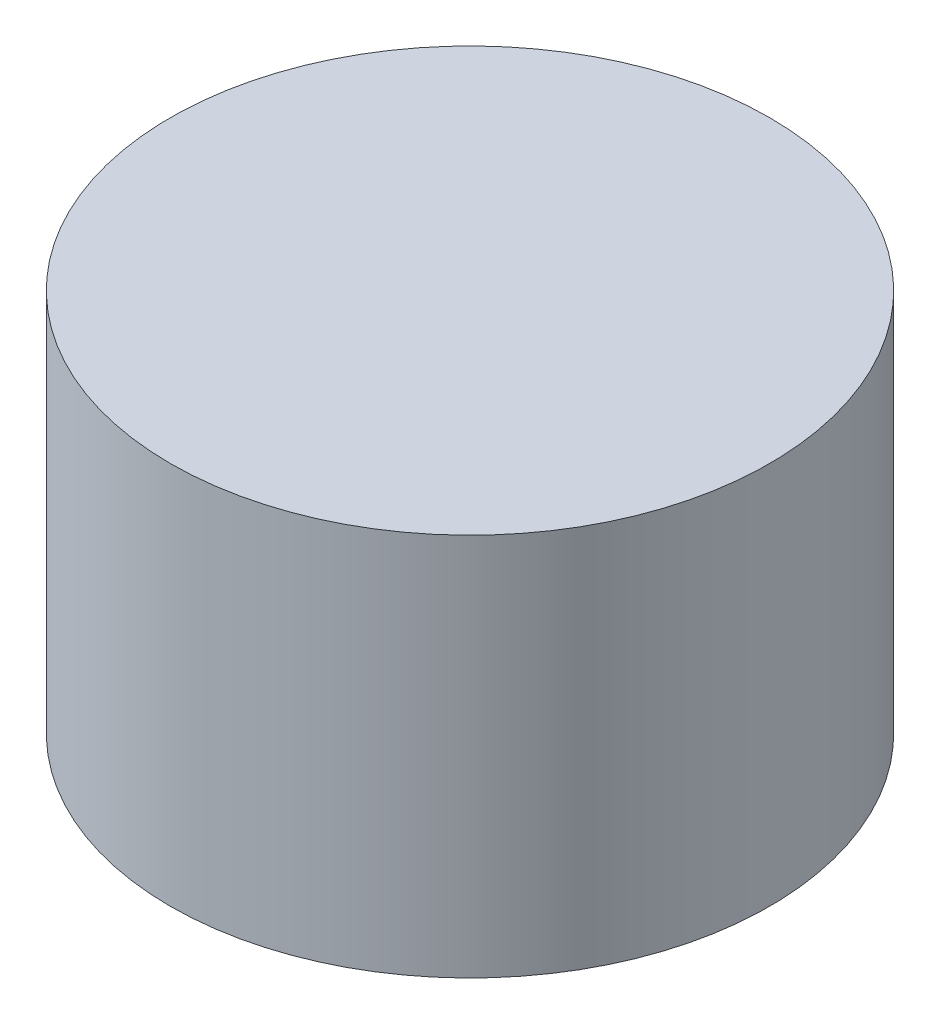
ISO-10303-21;
HEADER;
FILE_DESCRIPTION(('STEP AP214'),'2;1');
FILE_NAME('part.step','',(''),(''),'','','');
FILE_SCHEMA(('AUTOMOTIVE_DESIGN { 1 0 10303 214 1 1 1 1 }'));
ENDSEC;
DATA;
#1=APPLICATION_CONTEXT('core data for automotive mechanical design processes');
#2=APPLICATION_PROTOCOL_DEFINITION('international standard','automotive_design',2000,#1);
#3=PRODUCT_CONTEXT('',#1,'mechanical');
#4=PRODUCT('Part','Part','',(#3));
#5=PRODUCT_RELATED_PRODUCT_CATEGORY('part','',(#4));
#6=PRODUCT_DEFINITION_FORMATION('','',#4);
#7=PRODUCT_DEFINITION_CONTEXT('part definition',#1,'design');
#8=PRODUCT_DEFINITION('design','',#6,#7);
#9=PRODUCT_DEFINITION_SHAPE('','',#8);
#10=(LENGTH_UNIT() NAMED_UNIT(*) SI_UNIT(.MILLI.,.METRE.));
#11=(NAMED_UNIT(*) PLANE_ANGLE_UNIT() SI_UNIT($,.RADIAN.));
#12=(NAMED_UNIT(*) SI_UNIT($,.STERADIAN.) SOLID_ANGLE_UNIT());
#13=UNCERTAINTY_MEASURE_WITH_UNIT(LENGTH_MEASURE(1.E-05),#10,'distance_accuracy_value','');
#14=(GEOMETRIC_REPRESENTATION_CONTEXT(3) GLOBAL_UNCERTAINTY_ASSIGNED_CONTEXT((#13)) GLOBAL_UNIT_ASSIGNED_CONTEXT((#10,
#11,#12)) REPRESENTATION_CONTEXT('',''));
#15=CARTESIAN_POINT('',(0.,0.,0.));
#16=DIRECTION('',(0.,0.,1.));
#17=DIRECTION('',(1.,0.,0.));
#18=AXIS2_PLACEMENT_3D('',#15,#16,#17);
#19=CARTESIAN_POINT('',(0.,0.,0.));
#20=DIRECTION('',(0.,1.,0.));
#21=DIRECTION('',(0.,0.,1.));
#22=AXIS2_PLACEMENT_3D('',#19,#20,#21);
#23=PLANE('',#22);
#24=CARTESIAN_POINT('',(0.,0.,0.));
#25=DIRECTION('',(0.,-1.,0.));
#26=DIRECTION('',(0.,0.,-1.));
#27=AXIS2_PLACEMENT_3D('',#24,#25,#26);
#28=CIRCLE('',#27,1612.9);
#29=CARTESIAN_POINT('',(0.,0.,-1612.9));
#30=VERTEX_POINT('',#29);
#31=EDGE_CURVE('E10',#30,#30,#28,.T.);
#32=ORIENTED_EDGE('',*,*,#31,.F.);
#33=EDGE_LOOP('',(#32));
#34=FACE_BOUND('',#33,.T.);
#35=ADVANCED_FACE('F37',(#34),#23,.T.);
#36=CARTESIAN_POINT('',(0.,-482.6,0.));
#37=DIRECTION('',(0.,-1.,0.));
#38=DIRECTION('',(0.,0.,-1.));
#39=AXIS2_PLACEMENT_3D('',#36,#37,#38);
#40=CYLINDRICAL_SURFACE('',#39,1612.9);
#41=ORIENTED_EDGE('',*,*,#31,.T.);
#42=EDGE_LOOP('',(#41));
#43=FACE_BOUND('',#42,.T.);
#44=CARTESIAN_POINT('',(0.,-2064.512,0.));
#45=DIRECTION('',(0.,-1.,0.));
#46=DIRECTION('',(0.,0.,-1.));
#47=AXIS2_PLACEMENT_3D('',#44,#45,#46);
#48=CIRCLE('',#47,1612.9);
#49=CARTESIAN_POINT('',(0.,-2064.512,-1612.9));
#50=VERTEX_POINT('',#49);
#51=EDGE_CURVE('E44',#50,#50,#48,.T.);
#52=ORIENTED_EDGE('',*,*,#51,.F.);
#53=EDGE_LOOP('',(#52));
#54=FACE_BOUND('',#53,.T.);
#55=ADVANCED_FACE('F73',(#43,#54),#40,.T.);
#56=CARTESIAN_POINT('',(0.,-2064.512,-1612.9));
#57=DIRECTION('',(0.,-1.,0.));
#58=DIRECTION('',(0.,0.,-1.));
#59=AXIS2_PLACEMENT_3D('',#56,#57,#58);
#60=PLANE('',#59);
#61=ORIENTED_EDGE('',*,*,#51,.T.);
#62=EDGE_LOOP('',(#61));
#63=FACE_BOUND('',#62,.T.);
#64=CARTESIAN_POINT('',(0.,-2064.512,0.));
#65=DIRECTION('',(0.,-1.,0.));
#66=DIRECTION('',(0.,0.,-1.));
#67=AXIS2_PLACEMENT_3D('',#64,#65,#66);
#68=CIRCLE('',#67,1451.61);
#69=CARTESIAN_POINT('',(0.,-2064.512,-1451.61));
#70=VERTEX_POINT('',#69);
#71=EDGE_CURVE('E49',#70,#70,#68,.T.);
#72=ORIENTED_EDGE('',*,*,#71,.F.);
#73=EDGE_LOOP('',(#72));
#74=FACE_BOUND('',#73,.T.);
#75=ADVANCED_FACE('F65',(#63,#74),#60,.T.);
#76=CARTESIAN_POINT('',(0.,-482.6,0.));
#77=DIRECTION('',(0.,-1.,0.));
#78=DIRECTION('',(0.,0.,-1.));
#79=AXIS2_PLACEMENT_3D('',#76,#77,#78);
#80=CYLINDRICAL_SURFACE('',#79,1451.61);
#81=ORIENTED_EDGE('',*,*,#71,.T.);
#82=EDGE_LOOP('',(#81));
#83=FACE_BOUND('',#82,.T.);
#84=CARTESIAN_POINT('',(0.,-482.6,0.));
#85=DIRECTION('',(0.,-1.,0.));
#86=DIRECTION('',(0.,0.,-1.));
#87=AXIS2_PLACEMENT_3D('',#84,#85,#86);
#88=CIRCLE('',#87,1451.61);
#89=CARTESIAN_POINT('',(0.,-482.6,-1451.61));
#90=VERTEX_POINT('',#89);
#91=EDGE_CURVE('E54',#90,#90,#88,.T.);
#92=ORIENTED_EDGE('',*,*,#91,.F.);
#93=EDGE_LOOP('',(#92));
#94=FACE_BOUND('',#93,.T.);
#95=ADVANCED_FACE('F63',(#83,#94),#80,.F.);
#96=CARTESIAN_POINT('',(0.,-482.6,-1451.61));
#97=DIRECTION('',(0.,-1.,0.));
#98=DIRECTION('',(0.,0.,-1.));
#99=AXIS2_PLACEMENT_3D('',#96,#97,#98);
#100=PLANE('',#99);
#101=ORIENTED_EDGE('',*,*,#91,.T.);
#102=EDGE_LOOP('',(#101));
#103=FACE_BOUND('',#102,.T.);
#104=ADVANCED_FACE('F61',(#103),#100,.T.);
#105=CLOSED_SHELL('',(#35,#55,#75,#95,#104));
#106=MANIFOLD_SOLID_BREP('B2',#105);
#107=ADVANCED_BREP_SHAPE_REPRESENTATION('',(#18,#106),#14);
#108=SHAPE_DEFINITION_REPRESENTATION(#9,#107);
ENDSEC;
END-ISO-10303-21;
